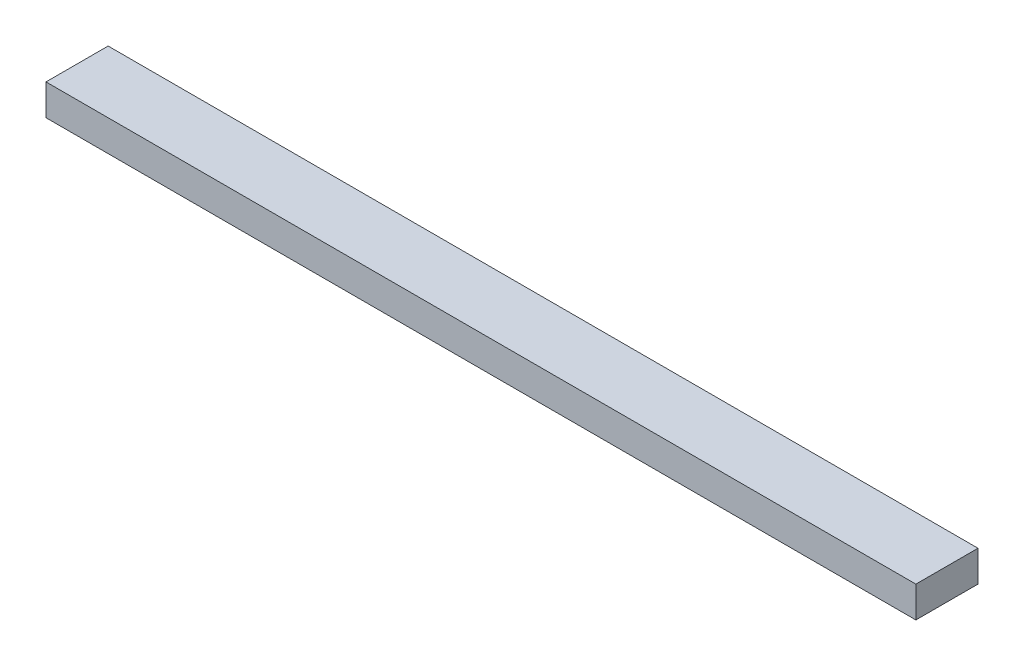
ISO-10303-21;
HEADER;
FILE_DESCRIPTION(('STEP AP214'),'2;1');
FILE_NAME('part.step','',(''),(''),'','','');
FILE_SCHEMA(('AUTOMOTIVE_DESIGN { 1 0 10303 214 1 1 1 1 }'));
ENDSEC;
DATA;
#1=APPLICATION_CONTEXT('core data for automotive mechanical design processes');
#2=APPLICATION_PROTOCOL_DEFINITION('international standard','automotive_design',2000,#1);
#3=PRODUCT_CONTEXT('',#1,'mechanical');
#4=PRODUCT('Part','Part','',(#3));
#5=PRODUCT_RELATED_PRODUCT_CATEGORY('part','',(#4));
#6=PRODUCT_DEFINITION_FORMATION('','',#4);
#7=PRODUCT_DEFINITION_CONTEXT('part definition',#1,'design');
#8=PRODUCT_DEFINITION('design','',#6,#7);
#9=PRODUCT_DEFINITION_SHAPE('','',#8);
#10=(LENGTH_UNIT() NAMED_UNIT(*) SI_UNIT(.MILLI.,.METRE.));
#11=(NAMED_UNIT(*) PLANE_ANGLE_UNIT() SI_UNIT($,.RADIAN.));
#12=(NAMED_UNIT(*) SI_UNIT($,.STERADIAN.) SOLID_ANGLE_UNIT());
#13=UNCERTAINTY_MEASURE_WITH_UNIT(LENGTH_MEASURE(1.E-05),#10,'distance_accuracy_value','');
#14=(GEOMETRIC_REPRESENTATION_CONTEXT(3) GLOBAL_UNCERTAINTY_ASSIGNED_CONTEXT((#13)) GLOBAL_UNIT_ASSIGNED_CONTEXT((#10,
#11,#12)) REPRESENTATION_CONTEXT('',''));
#15=CARTESIAN_POINT('',(0.,0.,0.));
#16=DIRECTION('',(0.,0.,1.));
#17=DIRECTION('',(1.,0.,0.));
#18=AXIS2_PLACEMENT_3D('',#15,#16,#17);
#19=CARTESIAN_POINT('',(-101.998172824787,26.3575437369829,20.));
#20=DIRECTION('',(1.,0.,0.));
#21=DIRECTION('',(0.,1.,0.));
#22=AXIS2_PLACEMENT_3D('',#19,#20,#21);
#23=PLANE('',#22);
#24=DIRECTION('',(0.,-1.,0.));
#25=VECTOR('',#24,1.);
#26=CARTESIAN_POINT('',(-101.998172824787,26.3575437369829,0.));
#27=LINE('',#26,#25);
#28=CARTESIAN_POINT('',(-101.998172824787,26.3575437369829,0.));
#29=VERTEX_POINT('',#28);
#30=CARTESIAN_POINT('',(-101.998172824787,16.3575437369829,0.));
#31=VERTEX_POINT('',#30);
#32=EDGE_CURVE('E96',#29,#31,#27,.T.);
#33=ORIENTED_EDGE('',*,*,#32,.T.);
#34=DIRECTION('',(0.,0.,-1.));
#35=VECTOR('',#34,1.);
#36=CARTESIAN_POINT('',(-101.998172824787,16.3575437369829,20.));
#37=LINE('',#36,#35);
#38=CARTESIAN_POINT('',(-101.998172824787,16.3575437369829,20.));
#39=VERTEX_POINT('',#38);
#40=EDGE_CURVE('E11',#39,#31,#37,.T.);
#41=ORIENTED_EDGE('',*,*,#40,.F.);
#42=DIRECTION('',(0.,-1.,0.));
#43=VECTOR('',#42,1.);
#44=CARTESIAN_POINT('',(-101.998172824787,26.3575437369829,20.));
#45=LINE('',#44,#43);
#46=CARTESIAN_POINT('',(-101.998172824787,26.3575437369829,20.));
#47=VERTEX_POINT('',#46);
#48=EDGE_CURVE('E84',#47,#39,#45,.T.);
#49=ORIENTED_EDGE('',*,*,#48,.F.);
#50=DIRECTION('',(0.,0.,-1.));
#51=VECTOR('',#50,1.);
#52=CARTESIAN_POINT('',(-101.998172824787,26.3575437369829,20.));
#53=LINE('',#52,#51);
#54=EDGE_CURVE('E92',#47,#29,#53,.T.);
#55=ORIENTED_EDGE('',*,*,#54,.T.);
#56=EDGE_LOOP('',(#33,#41,#49,#55));
#57=FACE_BOUND('',#56,.T.);
#58=ADVANCED_FACE('F33',(#57),#23,.F.);
#59=CARTESIAN_POINT('',(-101.998172824787,16.3575437369829,20.));
#60=DIRECTION('',(0.,1.,0.));
#61=DIRECTION('',(0.,0.,1.));
#62=AXIS2_PLACEMENT_3D('',#59,#60,#61);
#63=PLANE('',#62);
#64=DIRECTION('',(1.,0.,0.));
#65=VECTOR('',#64,1.);
#66=CARTESIAN_POINT('',(-101.998172824787,16.3575437369829,0.));
#67=LINE('',#66,#65);
#68=CARTESIAN_POINT('',(178.001827175213,16.3575437369829,0.));
#69=VERTEX_POINT('',#68);
#70=EDGE_CURVE('E88',#31,#69,#67,.T.);
#71=ORIENTED_EDGE('',*,*,#70,.T.);
#72=DIRECTION('',(0.,0.,-1.));
#73=VECTOR('',#72,1.);
#74=CARTESIAN_POINT('',(178.001827175213,16.3575437369829,20.));
#75=LINE('',#74,#73);
#76=CARTESIAN_POINT('',(178.001827175213,16.3575437369829,20.));
#77=VERTEX_POINT('',#76);
#78=EDGE_CURVE('E41',#77,#69,#75,.T.);
#79=ORIENTED_EDGE('',*,*,#78,.F.);
#80=DIRECTION('',(1.,0.,0.));
#81=VECTOR('',#80,1.);
#82=CARTESIAN_POINT('',(-101.998172824787,16.3575437369829,20.));
#83=LINE('',#82,#81);
#84=EDGE_CURVE('E79',#39,#77,#83,.T.);
#85=ORIENTED_EDGE('',*,*,#84,.F.);
#86=ORIENTED_EDGE('',*,*,#40,.T.);
#87=EDGE_LOOP('',(#71,#79,#85,#86));
#88=FACE_BOUND('',#87,.T.);
#89=ADVANCED_FACE('F87',(#88),#63,.F.);
#90=CARTESIAN_POINT('',(178.001827175213,26.3575437369829,20.));
#91=DIRECTION('',(-1.,0.,0.));
#92=DIRECTION('',(0.,-1.,0.));
#93=AXIS2_PLACEMENT_3D('',#90,#91,#92);
#94=PLANE('',#93);
#95=DIRECTION('',(0.,1.,0.));
#96=VECTOR('',#95,1.);
#97=CARTESIAN_POINT('',(178.001827175213,26.3575437369829,0.));
#98=LINE('',#97,#96);
#99=CARTESIAN_POINT('',(178.001827175213,26.3575437369829,0.));
#100=VERTEX_POINT('',#99);
#101=EDGE_CURVE('E66',#69,#100,#98,.T.);
#102=ORIENTED_EDGE('',*,*,#101,.T.);
#103=DIRECTION('',(0.,0.,-1.));
#104=VECTOR('',#103,1.);
#105=CARTESIAN_POINT('',(178.001827175213,26.3575437369829,20.));
#106=LINE('',#105,#104);
#107=CARTESIAN_POINT('',(178.001827175213,26.3575437369829,20.));
#108=VERTEX_POINT('',#107);
#109=EDGE_CURVE('E89',#108,#100,#106,.T.);
#110=ORIENTED_EDGE('',*,*,#109,.F.);
#111=DIRECTION('',(0.,1.,0.));
#112=VECTOR('',#111,1.);
#113=CARTESIAN_POINT('',(178.001827175213,26.3575437369829,20.));
#114=LINE('',#113,#112);
#115=EDGE_CURVE('E82',#77,#108,#114,.T.);
#116=ORIENTED_EDGE('',*,*,#115,.F.);
#117=ORIENTED_EDGE('',*,*,#78,.T.);
#118=EDGE_LOOP('',(#102,#110,#116,#117));
#119=FACE_BOUND('',#118,.T.);
#120=ADVANCED_FACE('F90',(#119),#94,.F.);
#121=CARTESIAN_POINT('',(-101.998172824787,26.3575437369829,20.));
#122=DIRECTION('',(0.,-1.,0.));
#123=DIRECTION('',(0.,0.,-1.));
#124=AXIS2_PLACEMENT_3D('',#121,#122,#123);
#125=PLANE('',#124);
#126=DIRECTION('',(-1.,0.,0.));
#127=VECTOR('',#126,1.);
#128=CARTESIAN_POINT('',(-101.998172824787,26.3575437369829,0.));
#129=LINE('',#128,#127);
#130=EDGE_CURVE('E72',#100,#29,#129,.T.);
#131=ORIENTED_EDGE('',*,*,#130,.T.);
#132=ORIENTED_EDGE('',*,*,#54,.F.);
#133=DIRECTION('',(-1.,0.,0.));
#134=VECTOR('',#133,1.);
#135=CARTESIAN_POINT('',(-101.998172824787,26.3575437369829,20.));
#136=LINE('',#135,#134);
#137=EDGE_CURVE('E49',#108,#47,#136,.T.);
#138=ORIENTED_EDGE('',*,*,#137,.F.);
#139=ORIENTED_EDGE('',*,*,#109,.T.);
#140=EDGE_LOOP('',(#131,#132,#138,#139));
#141=FACE_BOUND('',#140,.T.);
#142=ADVANCED_FACE('F103',(#141),#125,.F.);
#143=CARTESIAN_POINT('',(0.,0.,20.));
#144=DIRECTION('',(0.,0.,1.));
#145=DIRECTION('',(1.,0.,0.));
#146=AXIS2_PLACEMENT_3D('',#143,#144,#145);
#147=PLANE('',#146);
#148=ORIENTED_EDGE('',*,*,#48,.T.);
#149=ORIENTED_EDGE('',*,*,#84,.T.);
#150=ORIENTED_EDGE('',*,*,#115,.T.);
#151=ORIENTED_EDGE('',*,*,#137,.T.);
#152=EDGE_LOOP('',(#148,#149,#150,#151));
#153=FACE_BOUND('',#152,.T.);
#154=ADVANCED_FACE('F80',(#153),#147,.T.);
#155=CARTESIAN_POINT('',(0.,0.,0.));
#156=DIRECTION('',(0.,0.,1.));
#157=DIRECTION('',(1.,0.,0.));
#158=AXIS2_PLACEMENT_3D('',#155,#156,#157);
#159=PLANE('',#158);
#160=ORIENTED_EDGE('',*,*,#32,.F.);
#161=ORIENTED_EDGE('',*,*,#130,.F.);
#162=ORIENTED_EDGE('',*,*,#101,.F.);
#163=ORIENTED_EDGE('',*,*,#70,.F.);
#164=EDGE_LOOP('',(#160,#161,#162,#163));
#165=FACE_BOUND('',#164,.T.);
#166=ADVANCED_FACE('F106',(#165),#159,.F.);
#167=CLOSED_SHELL('',(#58,#89,#120,#142,#154,#166));
#168=MANIFOLD_SOLID_BREP('B2',#167);
#169=ADVANCED_BREP_SHAPE_REPRESENTATION('',(#18,#168),#14);
#170=SHAPE_DEFINITION_REPRESENTATION(#9,#169);
ENDSEC;
END-ISO-10303-21;
